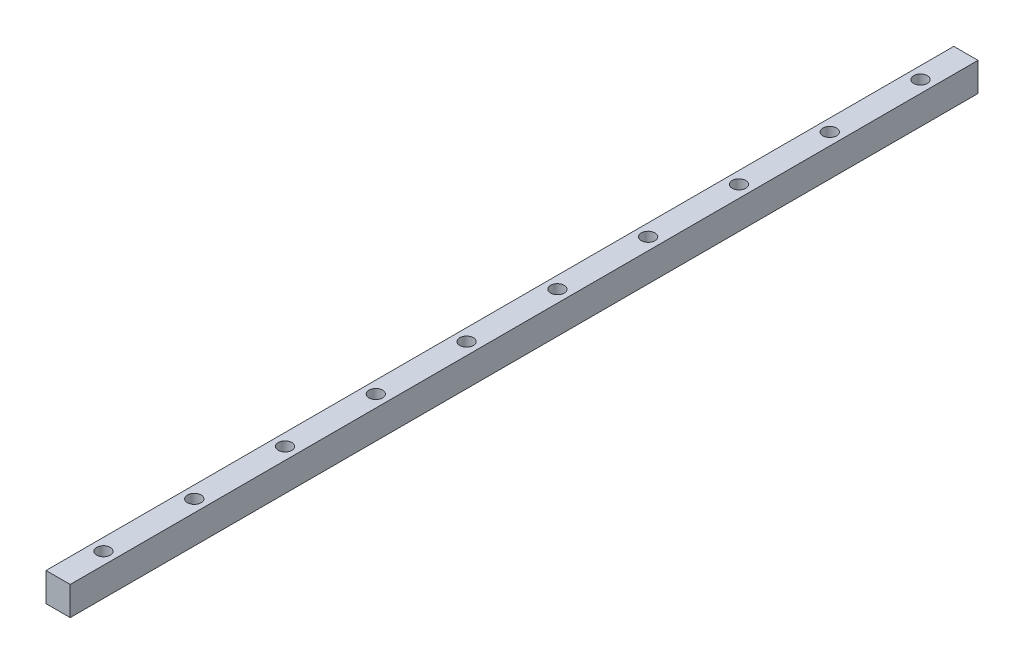
ISO-10303-21;
HEADER;
FILE_DESCRIPTION(('STEP AP214'),'2;1');
FILE_NAME('part.step','',(''),(''),'','','');
FILE_SCHEMA(('AUTOMOTIVE_DESIGN { 1 0 10303 214 1 1 1 1 }'));
ENDSEC;
DATA;
#1=APPLICATION_CONTEXT('core data for automotive mechanical design processes');
#2=APPLICATION_PROTOCOL_DEFINITION('international standard','automotive_design',2000,#1);
#3=PRODUCT_CONTEXT('',#1,'mechanical');
#4=PRODUCT('Part','Part','',(#3));
#5=PRODUCT_RELATED_PRODUCT_CATEGORY('part','',(#4));
#6=PRODUCT_DEFINITION_FORMATION('','',#4);
#7=PRODUCT_DEFINITION_CONTEXT('part definition',#1,'design');
#8=PRODUCT_DEFINITION('design','',#6,#7);
#9=PRODUCT_DEFINITION_SHAPE('','',#8);
#10=(LENGTH_UNIT() NAMED_UNIT(*) SI_UNIT(.MILLI.,.METRE.));
#11=(NAMED_UNIT(*) PLANE_ANGLE_UNIT() SI_UNIT($,.RADIAN.));
#12=(NAMED_UNIT(*) SI_UNIT($,.STERADIAN.) SOLID_ANGLE_UNIT());
#13=UNCERTAINTY_MEASURE_WITH_UNIT(LENGTH_MEASURE(1.E-05),#10,'distance_accuracy_value','');
#14=(GEOMETRIC_REPRESENTATION_CONTEXT(3) GLOBAL_UNCERTAINTY_ASSIGNED_CONTEXT((#13)) GLOBAL_UNIT_ASSIGNED_CONTEXT((#10,
#11,#12)) REPRESENTATION_CONTEXT('',''));
#15=CARTESIAN_POINT('',(0.,0.,0.));
#16=DIRECTION('',(0.,0.,1.));
#17=DIRECTION('',(1.,0.,0.));
#18=AXIS2_PLACEMENT_3D('',#15,#16,#17);
#19=CARTESIAN_POINT('',(0.,-4.75,285.));
#20=DIRECTION('',(0.,1.,0.));
#21=DIRECTION('',(0.,0.,1.));
#22=AXIS2_PLACEMENT_3D('',#19,#20,#21);
#23=CYLINDRICAL_SURFACE('',#22,2.25);
#24=CARTESIAN_POINT('',(0.,-4.75,285.));
#25=DIRECTION('',(0.,1.,0.));
#26=DIRECTION('',(0.,0.,1.));
#27=AXIS2_PLACEMENT_3D('',#24,#25,#26);
#28=CIRCLE('',#27,2.25);
#29=CARTESIAN_POINT('',(0.,-4.75,287.25));
#30=VERTEX_POINT('',#29);
#31=EDGE_CURVE('E41',#30,#30,#28,.T.);
#32=ORIENTED_EDGE('',*,*,#31,.F.);
#33=EDGE_LOOP('',(#32));
#34=FACE_BOUND('',#33,.T.);
#35=CARTESIAN_POINT('',(0.,4.75,285.));
#36=DIRECTION('',(0.,1.,0.));
#37=DIRECTION('',(0.,0.,1.));
#38=AXIS2_PLACEMENT_3D('',#35,#36,#37);
#39=CIRCLE('',#38,2.25);
#40=CARTESIAN_POINT('',(0.,4.75,287.25));
#41=VERTEX_POINT('',#40);
#42=EDGE_CURVE('E11',#41,#41,#39,.T.);
#43=ORIENTED_EDGE('',*,*,#42,.T.);
#44=EDGE_LOOP('',(#43));
#45=FACE_BOUND('',#44,.T.);
#46=ADVANCED_FACE('F33',(#34,#45),#23,.F.);
#47=CARTESIAN_POINT('',(0.,-4.75,255.));
#48=DIRECTION('',(0.,1.,0.));
#49=DIRECTION('',(0.,0.,1.));
#50=AXIS2_PLACEMENT_3D('',#47,#48,#49);
#51=CYLINDRICAL_SURFACE('',#50,2.25);
#52=CARTESIAN_POINT('',(0.,-4.75,255.));
#53=DIRECTION('',(0.,1.,0.));
#54=DIRECTION('',(0.,0.,1.));
#55=AXIS2_PLACEMENT_3D('',#52,#53,#54);
#56=CIRCLE('',#55,2.25);
#57=CARTESIAN_POINT('',(0.,-4.75,257.25));
#58=VERTEX_POINT('',#57);
#59=EDGE_CURVE('E147',#58,#58,#56,.T.);
#60=ORIENTED_EDGE('',*,*,#59,.F.);
#61=EDGE_LOOP('',(#60));
#62=FACE_BOUND('',#61,.T.);
#63=CARTESIAN_POINT('',(0.,4.75,255.));
#64=DIRECTION('',(0.,1.,0.));
#65=DIRECTION('',(0.,0.,1.));
#66=AXIS2_PLACEMENT_3D('',#63,#64,#65);
#67=CIRCLE('',#66,2.25);
#68=CARTESIAN_POINT('',(0.,4.75,257.25));
#69=VERTEX_POINT('',#68);
#70=EDGE_CURVE('E150',#69,#69,#67,.T.);
#71=ORIENTED_EDGE('',*,*,#70,.T.);
#72=EDGE_LOOP('',(#71));
#73=FACE_BOUND('',#72,.T.);
#74=ADVANCED_FACE('F159',(#62,#73),#51,.F.);
#75=CARTESIAN_POINT('',(0.,-4.75,225.));
#76=DIRECTION('',(0.,1.,0.));
#77=DIRECTION('',(0.,0.,1.));
#78=AXIS2_PLACEMENT_3D('',#75,#76,#77);
#79=CYLINDRICAL_SURFACE('',#78,2.25);
#80=CARTESIAN_POINT('',(0.,-4.75,225.));
#81=DIRECTION('',(0.,1.,0.));
#82=DIRECTION('',(0.,0.,1.));
#83=AXIS2_PLACEMENT_3D('',#80,#81,#82);
#84=CIRCLE('',#83,2.25);
#85=CARTESIAN_POINT('',(0.,-4.75,227.25));
#86=VERTEX_POINT('',#85);
#87=EDGE_CURVE('E141',#86,#86,#84,.T.);
#88=ORIENTED_EDGE('',*,*,#87,.F.);
#89=EDGE_LOOP('',(#88));
#90=FACE_BOUND('',#89,.T.);
#91=CARTESIAN_POINT('',(0.,4.75,225.));
#92=DIRECTION('',(0.,1.,0.));
#93=DIRECTION('',(0.,0.,1.));
#94=AXIS2_PLACEMENT_3D('',#91,#92,#93);
#95=CIRCLE('',#94,2.25);
#96=CARTESIAN_POINT('',(0.,4.75,227.25));
#97=VERTEX_POINT('',#96);
#98=EDGE_CURVE('E144',#97,#97,#95,.T.);
#99=ORIENTED_EDGE('',*,*,#98,.T.);
#100=EDGE_LOOP('',(#99));
#101=FACE_BOUND('',#100,.T.);
#102=ADVANCED_FACE('F196',(#90,#101),#79,.F.);
#103=CARTESIAN_POINT('',(0.,-4.75,195.));
#104=DIRECTION('',(0.,1.,0.));
#105=DIRECTION('',(0.,0.,1.));
#106=AXIS2_PLACEMENT_3D('',#103,#104,#105);
#107=CYLINDRICAL_SURFACE('',#106,2.25);
#108=CARTESIAN_POINT('',(0.,-4.75,195.));
#109=DIRECTION('',(0.,1.,0.));
#110=DIRECTION('',(0.,0.,1.));
#111=AXIS2_PLACEMENT_3D('',#108,#109,#110);
#112=CIRCLE('',#111,2.25);
#113=CARTESIAN_POINT('',(0.,-4.75,197.25));
#114=VERTEX_POINT('',#113);
#115=EDGE_CURVE('E135',#114,#114,#112,.T.);
#116=ORIENTED_EDGE('',*,*,#115,.F.);
#117=EDGE_LOOP('',(#116));
#118=FACE_BOUND('',#117,.T.);
#119=CARTESIAN_POINT('',(0.,4.75,195.));
#120=DIRECTION('',(0.,1.,0.));
#121=DIRECTION('',(0.,0.,1.));
#122=AXIS2_PLACEMENT_3D('',#119,#120,#121);
#123=CIRCLE('',#122,2.25);
#124=CARTESIAN_POINT('',(0.,4.75,197.25));
#125=VERTEX_POINT('',#124);
#126=EDGE_CURVE('E138',#125,#125,#123,.T.);
#127=ORIENTED_EDGE('',*,*,#126,.T.);
#128=EDGE_LOOP('',(#127));
#129=FACE_BOUND('',#128,.T.);
#130=ADVANCED_FACE('F192',(#118,#129),#107,.F.);
#131=CARTESIAN_POINT('',(0.,-4.75,165.));
#132=DIRECTION('',(0.,1.,0.));
#133=DIRECTION('',(0.,0.,1.));
#134=AXIS2_PLACEMENT_3D('',#131,#132,#133);
#135=CYLINDRICAL_SURFACE('',#134,2.25);
#136=CARTESIAN_POINT('',(0.,-4.75,165.));
#137=DIRECTION('',(0.,1.,0.));
#138=DIRECTION('',(0.,0.,1.));
#139=AXIS2_PLACEMENT_3D('',#136,#137,#138);
#140=CIRCLE('',#139,2.25);
#141=CARTESIAN_POINT('',(0.,-4.75,167.25));
#142=VERTEX_POINT('',#141);
#143=EDGE_CURVE('E129',#142,#142,#140,.T.);
#144=ORIENTED_EDGE('',*,*,#143,.F.);
#145=EDGE_LOOP('',(#144));
#146=FACE_BOUND('',#145,.T.);
#147=CARTESIAN_POINT('',(0.,4.75,165.));
#148=DIRECTION('',(0.,1.,0.));
#149=DIRECTION('',(0.,0.,1.));
#150=AXIS2_PLACEMENT_3D('',#147,#148,#149);
#151=CIRCLE('',#150,2.25);
#152=CARTESIAN_POINT('',(0.,4.75,167.25));
#153=VERTEX_POINT('',#152);
#154=EDGE_CURVE('E132',#153,#153,#151,.T.);
#155=ORIENTED_EDGE('',*,*,#154,.T.);
#156=EDGE_LOOP('',(#155));
#157=FACE_BOUND('',#156,.T.);
#158=ADVANCED_FACE('F188',(#146,#157),#135,.F.);
#159=CARTESIAN_POINT('',(0.,-4.75,135.));
#160=DIRECTION('',(0.,1.,0.));
#161=DIRECTION('',(0.,0.,1.));
#162=AXIS2_PLACEMENT_3D('',#159,#160,#161);
#163=CYLINDRICAL_SURFACE('',#162,2.25);
#164=CARTESIAN_POINT('',(0.,-4.75,135.));
#165=DIRECTION('',(0.,1.,0.));
#166=DIRECTION('',(0.,0.,1.));
#167=AXIS2_PLACEMENT_3D('',#164,#165,#166);
#168=CIRCLE('',#167,2.25);
#169=CARTESIAN_POINT('',(0.,-4.75,137.25));
#170=VERTEX_POINT('',#169);
#171=EDGE_CURVE('E123',#170,#170,#168,.T.);
#172=ORIENTED_EDGE('',*,*,#171,.F.);
#173=EDGE_LOOP('',(#172));
#174=FACE_BOUND('',#173,.T.);
#175=CARTESIAN_POINT('',(0.,4.75,135.));
#176=DIRECTION('',(0.,1.,0.));
#177=DIRECTION('',(0.,0.,1.));
#178=AXIS2_PLACEMENT_3D('',#175,#176,#177);
#179=CIRCLE('',#178,2.25);
#180=CARTESIAN_POINT('',(0.,4.75,137.25));
#181=VERTEX_POINT('',#180);
#182=EDGE_CURVE('E126',#181,#181,#179,.T.);
#183=ORIENTED_EDGE('',*,*,#182,.T.);
#184=EDGE_LOOP('',(#183));
#185=FACE_BOUND('',#184,.T.);
#186=ADVANCED_FACE('F184',(#174,#185),#163,.F.);
#187=CARTESIAN_POINT('',(0.,-4.75,105.));
#188=DIRECTION('',(0.,1.,0.));
#189=DIRECTION('',(0.,0.,1.));
#190=AXIS2_PLACEMENT_3D('',#187,#188,#189);
#191=CYLINDRICAL_SURFACE('',#190,2.25);
#192=CARTESIAN_POINT('',(0.,-4.75,105.));
#193=DIRECTION('',(0.,1.,0.));
#194=DIRECTION('',(0.,0.,1.));
#195=AXIS2_PLACEMENT_3D('',#192,#193,#194);
#196=CIRCLE('',#195,2.25);
#197=CARTESIAN_POINT('',(0.,-4.75,107.25));
#198=VERTEX_POINT('',#197);
#199=EDGE_CURVE('E117',#198,#198,#196,.T.);
#200=ORIENTED_EDGE('',*,*,#199,.F.);
#201=EDGE_LOOP('',(#200));
#202=FACE_BOUND('',#201,.T.);
#203=CARTESIAN_POINT('',(0.,4.75,105.));
#204=DIRECTION('',(0.,1.,0.));
#205=DIRECTION('',(0.,0.,1.));
#206=AXIS2_PLACEMENT_3D('',#203,#204,#205);
#207=CIRCLE('',#206,2.25);
#208=CARTESIAN_POINT('',(0.,4.75,107.25));
#209=VERTEX_POINT('',#208);
#210=EDGE_CURVE('E120',#209,#209,#207,.T.);
#211=ORIENTED_EDGE('',*,*,#210,.T.);
#212=EDGE_LOOP('',(#211));
#213=FACE_BOUND('',#212,.T.);
#214=ADVANCED_FACE('F180',(#202,#213),#191,.F.);
#215=CARTESIAN_POINT('',(0.,-4.75,75.));
#216=DIRECTION('',(0.,1.,0.));
#217=DIRECTION('',(0.,0.,1.));
#218=AXIS2_PLACEMENT_3D('',#215,#216,#217);
#219=CYLINDRICAL_SURFACE('',#218,2.25);
#220=CARTESIAN_POINT('',(0.,-4.75,75.));
#221=DIRECTION('',(0.,1.,0.));
#222=DIRECTION('',(0.,0.,1.));
#223=AXIS2_PLACEMENT_3D('',#220,#221,#222);
#224=CIRCLE('',#223,2.25);
#225=CARTESIAN_POINT('',(0.,-4.75,77.25));
#226=VERTEX_POINT('',#225);
#227=EDGE_CURVE('E111',#226,#226,#224,.T.);
#228=ORIENTED_EDGE('',*,*,#227,.F.);
#229=EDGE_LOOP('',(#228));
#230=FACE_BOUND('',#229,.T.);
#231=CARTESIAN_POINT('',(0.,4.75,75.));
#232=DIRECTION('',(0.,1.,0.));
#233=DIRECTION('',(0.,0.,1.));
#234=AXIS2_PLACEMENT_3D('',#231,#232,#233);
#235=CIRCLE('',#234,2.25);
#236=CARTESIAN_POINT('',(0.,4.75,77.25));
#237=VERTEX_POINT('',#236);
#238=EDGE_CURVE('E114',#237,#237,#235,.T.);
#239=ORIENTED_EDGE('',*,*,#238,.T.);
#240=EDGE_LOOP('',(#239));
#241=FACE_BOUND('',#240,.T.);
#242=ADVANCED_FACE('F171',(#230,#241),#219,.F.);
#243=CARTESIAN_POINT('',(4.,-4.75,300.));
#244=DIRECTION('',(-1.,0.,0.));
#245=DIRECTION('',(0.,0.,1.));
#246=AXIS2_PLACEMENT_3D('',#243,#244,#245);
#247=PLANE('',#246);
#248=DIRECTION('',(0.,1.,0.));
#249=VECTOR('',#248,1.);
#250=CARTESIAN_POINT('',(4.,-4.75,0.));
#251=LINE('',#250,#249);
#252=CARTESIAN_POINT('',(4.,-4.75,0.));
#253=VERTEX_POINT('',#252);
#254=CARTESIAN_POINT('',(4.,4.75,0.));
#255=VERTEX_POINT('',#254);
#256=EDGE_CURVE('E101',#253,#255,#251,.T.);
#257=ORIENTED_EDGE('',*,*,#256,.T.);
#258=DIRECTION('',(0.,0.,-1.));
#259=VECTOR('',#258,1.);
#260=CARTESIAN_POINT('',(4.,4.75,300.));
#261=LINE('',#260,#259);
#262=CARTESIAN_POINT('',(4.,4.75,300.));
#263=VERTEX_POINT('',#262);
#264=EDGE_CURVE('E92',#263,#255,#261,.T.);
#265=ORIENTED_EDGE('',*,*,#264,.F.);
#266=DIRECTION('',(0.,1.,0.));
#267=VECTOR('',#266,1.);
#268=CARTESIAN_POINT('',(4.,-4.75,300.));
#269=LINE('',#268,#267);
#270=CARTESIAN_POINT('',(4.,-4.75,300.));
#271=VERTEX_POINT('',#270);
#272=EDGE_CURVE('E85',#271,#263,#269,.T.);
#273=ORIENTED_EDGE('',*,*,#272,.F.);
#274=DIRECTION('',(0.,0.,-1.));
#275=VECTOR('',#274,1.);
#276=CARTESIAN_POINT('',(4.,-4.75,300.));
#277=LINE('',#276,#275);
#278=EDGE_CURVE('E97',#271,#253,#277,.T.);
#279=ORIENTED_EDGE('',*,*,#278,.T.);
#280=EDGE_LOOP('',(#257,#265,#273,#279));
#281=FACE_BOUND('',#280,.T.);
#282=ADVANCED_FACE('F163',(#281),#247,.F.);
#283=CARTESIAN_POINT('',(-4.,4.75,300.));
#284=DIRECTION('',(0.,-1.,0.));
#285=DIRECTION('',(0.,0.,-1.));
#286=AXIS2_PLACEMENT_3D('',#283,#284,#285);
#287=PLANE('',#286);
#288=CARTESIAN_POINT('',(0.,4.75,45.));
#289=DIRECTION('',(0.,1.,0.));
#290=DIRECTION('',(0.,0.,1.));
#291=AXIS2_PLACEMENT_3D('',#288,#289,#290);
#292=CIRCLE('',#291,2.25);
#293=CARTESIAN_POINT('',(0.,4.75,47.25));
#294=VERTEX_POINT('',#293);
#295=EDGE_CURVE('E235',#294,#294,#292,.T.);
#296=ORIENTED_EDGE('',*,*,#295,.F.);
#297=EDGE_LOOP('',(#296));
#298=FACE_BOUND('',#297,.T.);
#299=CARTESIAN_POINT('',(0.,4.75,15.));
#300=DIRECTION('',(0.,1.,0.));
#301=DIRECTION('',(0.,0.,1.));
#302=AXIS2_PLACEMENT_3D('',#299,#300,#301);
#303=CIRCLE('',#302,2.25);
#304=CARTESIAN_POINT('',(0.,4.75,17.25));
#305=VERTEX_POINT('',#304);
#306=EDGE_CURVE('E236',#305,#305,#303,.T.);
#307=ORIENTED_EDGE('',*,*,#306,.F.);
#308=EDGE_LOOP('',(#307));
#309=FACE_BOUND('',#308,.T.);
#310=DIRECTION('',(-1.,0.,0.));
#311=VECTOR('',#310,1.);
#312=CARTESIAN_POINT('',(-4.,4.75,0.));
#313=LINE('',#312,#311);
#314=CARTESIAN_POINT('',(-4.,4.75,0.));
#315=VERTEX_POINT('',#314);
#316=EDGE_CURVE('E91',#255,#315,#313,.T.);
#317=ORIENTED_EDGE('',*,*,#316,.T.);
#318=DIRECTION('',(0.,0.,-1.));
#319=VECTOR('',#318,1.);
#320=CARTESIAN_POINT('',(-4.,4.75,300.));
#321=LINE('',#320,#319);
#322=CARTESIAN_POINT('',(-4.,4.75,300.));
#323=VERTEX_POINT('',#322);
#324=EDGE_CURVE('E88',#323,#315,#321,.T.);
#325=ORIENTED_EDGE('',*,*,#324,.F.);
#326=DIRECTION('',(-1.,0.,0.));
#327=VECTOR('',#326,1.);
#328=CARTESIAN_POINT('',(-4.,4.75,300.));
#329=LINE('',#328,#327);
#330=EDGE_CURVE('E80',#263,#323,#329,.T.);
#331=ORIENTED_EDGE('',*,*,#330,.F.);
#332=ORIENTED_EDGE('',*,*,#264,.T.);
#333=EDGE_LOOP('',(#317,#325,#331,#332));
#334=FACE_BOUND('',#333,.T.);
#335=ORIENTED_EDGE('',*,*,#238,.F.);
#336=EDGE_LOOP('',(#335));
#337=FACE_BOUND('',#336,.T.);
#338=ORIENTED_EDGE('',*,*,#210,.F.);
#339=EDGE_LOOP('',(#338));
#340=FACE_BOUND('',#339,.T.);
#341=ORIENTED_EDGE('',*,*,#182,.F.);
#342=EDGE_LOOP('',(#341));
#343=FACE_BOUND('',#342,.T.);
#344=ORIENTED_EDGE('',*,*,#154,.F.);
#345=EDGE_LOOP('',(#344));
#346=FACE_BOUND('',#345,.T.);
#347=ORIENTED_EDGE('',*,*,#126,.F.);
#348=EDGE_LOOP('',(#347));
#349=FACE_BOUND('',#348,.T.);
#350=ORIENTED_EDGE('',*,*,#98,.F.);
#351=EDGE_LOOP('',(#350));
#352=FACE_BOUND('',#351,.T.);
#353=ORIENTED_EDGE('',*,*,#70,.F.);
#354=EDGE_LOOP('',(#353));
#355=FACE_BOUND('',#354,.T.);
#356=ORIENTED_EDGE('',*,*,#42,.F.);
#357=EDGE_LOOP('',(#356));
#358=FACE_BOUND('',#357,.T.);
#359=ADVANCED_FACE('F89',(#298,#309,#334,#337,#340,#343,#346,#349,#352,#355,#358),#287,.F.);
#360=CARTESIAN_POINT('',(-4.,-4.75,300.));
#361=DIRECTION('',(1.,0.,0.));
#362=DIRECTION('',(0.,0.,-1.));
#363=AXIS2_PLACEMENT_3D('',#360,#361,#362);
#364=PLANE('',#363);
#365=DIRECTION('',(0.,-1.,0.));
#366=VECTOR('',#365,1.);
#367=CARTESIAN_POINT('',(-4.,-4.75,0.));
#368=LINE('',#367,#366);
#369=CARTESIAN_POINT('',(-4.,-4.75,0.));
#370=VERTEX_POINT('',#369);
#371=EDGE_CURVE('E66',#315,#370,#368,.T.);
#372=ORIENTED_EDGE('',*,*,#371,.T.);
#373=DIRECTION('',(0.,0.,-1.));
#374=VECTOR('',#373,1.);
#375=CARTESIAN_POINT('',(-4.,-4.75,300.));
#376=LINE('',#375,#374);
#377=CARTESIAN_POINT('',(-4.,-4.75,300.));
#378=VERTEX_POINT('',#377);
#379=EDGE_CURVE('E93',#378,#370,#376,.T.);
#380=ORIENTED_EDGE('',*,*,#379,.F.);
#381=DIRECTION('',(0.,-1.,0.));
#382=VECTOR('',#381,1.);
#383=CARTESIAN_POINT('',(-4.,-4.75,300.));
#384=LINE('',#383,#382);
#385=EDGE_CURVE('E83',#323,#378,#384,.T.);
#386=ORIENTED_EDGE('',*,*,#385,.F.);
#387=ORIENTED_EDGE('',*,*,#324,.T.);
#388=EDGE_LOOP('',(#372,#380,#386,#387));
#389=FACE_BOUND('',#388,.T.);
#390=ADVANCED_FACE('F95',(#389),#364,.F.);
#391=CARTESIAN_POINT('',(-4.,-4.75,300.));
#392=DIRECTION('',(0.,1.,0.));
#393=DIRECTION('',(0.,0.,1.));
#394=AXIS2_PLACEMENT_3D('',#391,#392,#393);
#395=PLANE('',#394);
#396=CARTESIAN_POINT('',(0.,-4.75,45.));
#397=DIRECTION('',(0.,1.,0.));
#398=DIRECTION('',(0.,0.,1.));
#399=AXIS2_PLACEMENT_3D('',#396,#397,#398);
#400=CIRCLE('',#399,2.25);
#401=CARTESIAN_POINT('',(0.,-4.75,47.25));
#402=VERTEX_POINT('',#401);
#403=EDGE_CURVE('E233',#402,#402,#400,.T.);
#404=ORIENTED_EDGE('',*,*,#403,.T.);
#405=EDGE_LOOP('',(#404));
#406=FACE_BOUND('',#405,.T.);
#407=CARTESIAN_POINT('',(0.,-4.75,15.));
#408=DIRECTION('',(0.,1.,0.));
#409=DIRECTION('',(0.,0.,1.));
#410=AXIS2_PLACEMENT_3D('',#407,#408,#409);
#411=CIRCLE('',#410,2.25);
#412=CARTESIAN_POINT('',(0.,-4.75,17.25));
#413=VERTEX_POINT('',#412);
#414=EDGE_CURVE('E104',#413,#413,#411,.T.);
#415=ORIENTED_EDGE('',*,*,#414,.T.);
#416=EDGE_LOOP('',(#415));
#417=FACE_BOUND('',#416,.T.);
#418=DIRECTION('',(1.,0.,0.));
#419=VECTOR('',#418,1.);
#420=CARTESIAN_POINT('',(-4.,-4.75,0.));
#421=LINE('',#420,#419);
#422=EDGE_CURVE('E72',#370,#253,#421,.T.);
#423=ORIENTED_EDGE('',*,*,#422,.T.);
#424=ORIENTED_EDGE('',*,*,#278,.F.);
#425=DIRECTION('',(1.,0.,0.));
#426=VECTOR('',#425,1.);
#427=CARTESIAN_POINT('',(-4.,-4.75,300.));
#428=LINE('',#427,#426);
#429=EDGE_CURVE('E49',#378,#271,#428,.T.);
#430=ORIENTED_EDGE('',*,*,#429,.F.);
#431=ORIENTED_EDGE('',*,*,#379,.T.);
#432=EDGE_LOOP('',(#423,#424,#430,#431));
#433=FACE_BOUND('',#432,.T.);
#434=ORIENTED_EDGE('',*,*,#227,.T.);
#435=EDGE_LOOP('',(#434));
#436=FACE_BOUND('',#435,.T.);
#437=ORIENTED_EDGE('',*,*,#199,.T.);
#438=EDGE_LOOP('',(#437));
#439=FACE_BOUND('',#438,.T.);
#440=ORIENTED_EDGE('',*,*,#171,.T.);
#441=EDGE_LOOP('',(#440));
#442=FACE_BOUND('',#441,.T.);
#443=ORIENTED_EDGE('',*,*,#143,.T.);
#444=EDGE_LOOP('',(#443));
#445=FACE_BOUND('',#444,.T.);
#446=ORIENTED_EDGE('',*,*,#115,.T.);
#447=EDGE_LOOP('',(#446));
#448=FACE_BOUND('',#447,.T.);
#449=ORIENTED_EDGE('',*,*,#87,.T.);
#450=EDGE_LOOP('',(#449));
#451=FACE_BOUND('',#450,.T.);
#452=ORIENTED_EDGE('',*,*,#59,.T.);
#453=EDGE_LOOP('',(#452));
#454=FACE_BOUND('',#453,.T.);
#455=ORIENTED_EDGE('',*,*,#31,.T.);
#456=EDGE_LOOP('',(#455));
#457=FACE_BOUND('',#456,.T.);
#458=ADVANCED_FACE('F155',(#406,#417,#433,#436,#439,#442,#445,#448,#451,#454,#457),#395,.F.);
#459=CARTESIAN_POINT('',(0.,0.,300.));
#460=DIRECTION('',(0.,0.,-1.));
#461=DIRECTION('',(-1.,0.,0.));
#462=AXIS2_PLACEMENT_3D('',#459,#460,#461);
#463=PLANE('',#462);
#464=ORIENTED_EDGE('',*,*,#272,.T.);
#465=ORIENTED_EDGE('',*,*,#330,.T.);
#466=ORIENTED_EDGE('',*,*,#385,.T.);
#467=ORIENTED_EDGE('',*,*,#429,.T.);
#468=EDGE_LOOP('',(#464,#465,#466,#467));
#469=FACE_BOUND('',#468,.T.);
#470=ADVANCED_FACE('F81',(#469),#463,.F.);
#471=CARTESIAN_POINT('',(0.,0.,0.));
#472=DIRECTION('',(0.,0.,-1.));
#473=DIRECTION('',(-1.,0.,0.));
#474=AXIS2_PLACEMENT_3D('',#471,#472,#473);
#475=PLANE('',#474);
#476=ORIENTED_EDGE('',*,*,#256,.F.);
#477=ORIENTED_EDGE('',*,*,#422,.F.);
#478=ORIENTED_EDGE('',*,*,#371,.F.);
#479=ORIENTED_EDGE('',*,*,#316,.F.);
#480=EDGE_LOOP('',(#476,#477,#478,#479));
#481=FACE_BOUND('',#480,.T.);
#482=ADVANCED_FACE('F214',(#481),#475,.T.);
#483=CARTESIAN_POINT('',(0.,-4.75,15.));
#484=DIRECTION('',(0.,1.,0.));
#485=DIRECTION('',(0.,0.,1.));
#486=AXIS2_PLACEMENT_3D('',#483,#484,#485);
#487=CYLINDRICAL_SURFACE('',#486,2.25);
#488=ORIENTED_EDGE('',*,*,#414,.F.);
#489=EDGE_LOOP('',(#488));
#490=FACE_BOUND('',#489,.T.);
#491=ORIENTED_EDGE('',*,*,#306,.T.);
#492=EDGE_LOOP('',(#491));
#493=FACE_BOUND('',#492,.T.);
#494=ADVANCED_FACE('F220',(#490,#493),#487,.F.);
#495=CARTESIAN_POINT('',(0.,-4.75,45.));
#496=DIRECTION('',(0.,1.,0.));
#497=DIRECTION('',(0.,0.,1.));
#498=AXIS2_PLACEMENT_3D('',#495,#496,#497);
#499=CYLINDRICAL_SURFACE('',#498,2.25);
#500=ORIENTED_EDGE('',*,*,#403,.F.);
#501=EDGE_LOOP('',(#500));
#502=FACE_BOUND('',#501,.T.);
#503=ORIENTED_EDGE('',*,*,#295,.T.);
#504=EDGE_LOOP('',(#503));
#505=FACE_BOUND('',#504,.T.);
#506=ADVANCED_FACE('F225',(#502,#505),#499,.F.);
#507=CLOSED_SHELL('',(#46,#74,#102,#130,#158,#186,#214,#242,#282,#359,#390,#458,#470,#482,#494,#506));
#508=MANIFOLD_SOLID_BREP('B2',#507);
#509=ADVANCED_BREP_SHAPE_REPRESENTATION('',(#18,#508),#14);
#510=SHAPE_DEFINITION_REPRESENTATION(#9,#509);
ENDSEC;
END-ISO-10303-21;
